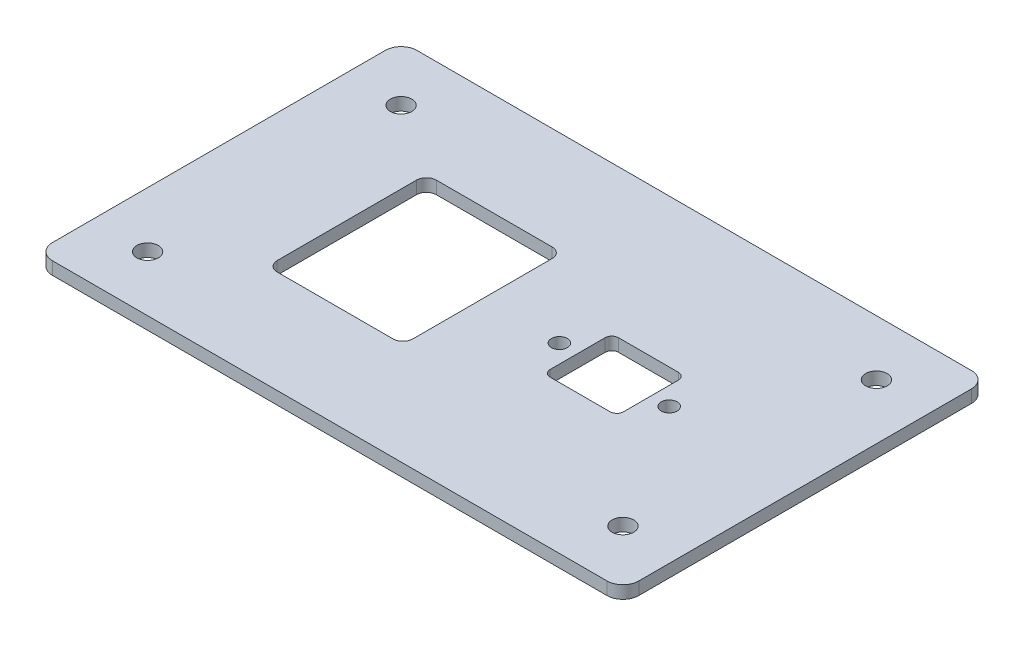
ISO-10303-21;
HEADER;
FILE_DESCRIPTION(('STEP AP214'),'2;1');
FILE_NAME('part.step','',(''),(''),'','','');
FILE_SCHEMA(('AUTOMOTIVE_DESIGN { 1 0 10303 214 1 1 1 1 }'));
ENDSEC;
DATA;
#1=APPLICATION_CONTEXT('core data for automotive mechanical design processes');
#2=APPLICATION_PROTOCOL_DEFINITION('international standard','automotive_design',2000,#1);
#3=PRODUCT_CONTEXT('',#1,'mechanical');
#4=PRODUCT('Part','Part','',(#3));
#5=PRODUCT_RELATED_PRODUCT_CATEGORY('part','',(#4));
#6=PRODUCT_DEFINITION_FORMATION('','',#4);
#7=PRODUCT_DEFINITION_CONTEXT('part definition',#1,'design');
#8=PRODUCT_DEFINITION('design','',#6,#7);
#9=PRODUCT_DEFINITION_SHAPE('','',#8);
#10=(LENGTH_UNIT() NAMED_UNIT(*) SI_UNIT(.MILLI.,.METRE.));
#11=(NAMED_UNIT(*) PLANE_ANGLE_UNIT() SI_UNIT($,.RADIAN.));
#12=(NAMED_UNIT(*) SI_UNIT($,.STERADIAN.) SOLID_ANGLE_UNIT());
#13=UNCERTAINTY_MEASURE_WITH_UNIT(LENGTH_MEASURE(1.E-05),#10,'distance_accuracy_value','');
#14=(GEOMETRIC_REPRESENTATION_CONTEXT(3) GLOBAL_UNCERTAINTY_ASSIGNED_CONTEXT((#13)) GLOBAL_UNIT_ASSIGNED_CONTEXT((#10,
#11,#12)) REPRESENTATION_CONTEXT('',''));
#15=CARTESIAN_POINT('',(0.,0.,0.));
#16=DIRECTION('',(0.,0.,1.));
#17=DIRECTION('',(1.,0.,0.));
#18=AXIS2_PLACEMENT_3D('',#15,#16,#17);
#19=CARTESIAN_POINT('',(55.5625,2.54,-33.3375));
#20=DIRECTION('',(0.,-1.,0.));
#21=DIRECTION('',(0.,0.,-1.));
#22=AXIS2_PLACEMENT_3D('',#19,#20,#21);
#23=PLANE('',#22);
#24=CARTESIAN_POINT('',(31.5,2.54,0.));
#25=DIRECTION('',(0.,1.,0.));
#26=DIRECTION('',(0.,0.,1.));
#27=AXIS2_PLACEMENT_3D('',#24,#25,#26);
#28=CIRCLE('',#27,1.6);
#29=CARTESIAN_POINT('',(31.5,2.54,1.6));
#30=VERTEX_POINT('',#29);
#31=EDGE_CURVE('E447',#30,#30,#28,.T.);
#32=ORIENTED_EDGE('',*,*,#31,.F.);
#33=EDGE_LOOP('',(#32));
#34=FACE_BOUND('',#33,.T.);
#35=CARTESIAN_POINT('',(9.49999999999999,2.54,0.));
#36=DIRECTION('',(0.,1.,0.));
#37=DIRECTION('',(0.,0.,1.));
#38=AXIS2_PLACEMENT_3D('',#35,#36,#37);
#39=CIRCLE('',#38,1.6);
#40=CARTESIAN_POINT('',(9.49999999999999,2.54,1.6));
#41=VERTEX_POINT('',#40);
#42=EDGE_CURVE('E459',#41,#41,#39,.T.);
#43=ORIENTED_EDGE('',*,*,#42,.F.);
#44=EDGE_LOOP('',(#43));
#45=FACE_BOUND('',#44,.T.);
#46=CARTESIAN_POINT('',(26.5,2.54,-5.49999999999999));
#47=DIRECTION('',(0.,1.,0.));
#48=DIRECTION('',(0.,0.,-1.));
#49=AXIS2_PLACEMENT_3D('',#46,#47,#48);
#50=CIRCLE('',#49,1.35);
#51=CARTESIAN_POINT('',(27.85,2.54,-5.49999999999999));
#52=VERTEX_POINT('',#51);
#53=CARTESIAN_POINT('',(26.5,2.54,-6.85));
#54=VERTEX_POINT('',#53);
#55=EDGE_CURVE('E466',#52,#54,#50,.T.);
#56=ORIENTED_EDGE('',*,*,#55,.F.);
#57=DIRECTION('',(0.,0.,-1.));
#58=VECTOR('',#57,1.);
#59=CARTESIAN_POINT('',(27.85,2.54,5.50000000000001));
#60=LINE('',#59,#58);
#61=CARTESIAN_POINT('',(27.85,2.54,5.50000000000001));
#62=VERTEX_POINT('',#61);
#63=EDGE_CURVE('E517',#62,#52,#60,.T.);
#64=ORIENTED_EDGE('',*,*,#63,.F.);
#65=CARTESIAN_POINT('',(26.5,2.54,5.50000000000001));
#66=DIRECTION('',(0.,1.,0.));
#67=DIRECTION('',(0.,0.,1.));
#68=AXIS2_PLACEMENT_3D('',#65,#66,#67);
#69=CIRCLE('',#68,1.35);
#70=CARTESIAN_POINT('',(26.5,2.54,6.85));
#71=VERTEX_POINT('',#70);
#72=EDGE_CURVE('E542',#71,#62,#69,.T.);
#73=ORIENTED_EDGE('',*,*,#72,.F.);
#74=DIRECTION('',(1.,0.,0.));
#75=VECTOR('',#74,1.);
#76=CARTESIAN_POINT('',(14.5,2.54,6.85));
#77=LINE('',#76,#75);
#78=CARTESIAN_POINT('',(14.5,2.54,6.85));
#79=VERTEX_POINT('',#78);
#80=EDGE_CURVE('E549',#79,#71,#77,.T.);
#81=ORIENTED_EDGE('',*,*,#80,.F.);
#82=CARTESIAN_POINT('',(14.5,2.54,5.5));
#83=DIRECTION('',(0.,1.,0.));
#84=DIRECTION('',(0.,0.,-1.));
#85=AXIS2_PLACEMENT_3D('',#82,#83,#84);
#86=CIRCLE('',#85,1.35);
#87=CARTESIAN_POINT('',(13.15,2.54,5.5));
#88=VERTEX_POINT('',#87);
#89=EDGE_CURVE('E552',#88,#79,#86,.T.);
#90=ORIENTED_EDGE('',*,*,#89,.F.);
#91=DIRECTION('',(0.,0.,1.));
#92=VECTOR('',#91,1.);
#93=CARTESIAN_POINT('',(13.15,2.54,5.5));
#94=LINE('',#93,#92);
#95=CARTESIAN_POINT('',(13.15,2.54,-5.49999999999999));
#96=VERTEX_POINT('',#95);
#97=EDGE_CURVE('E555',#96,#88,#94,.T.);
#98=ORIENTED_EDGE('',*,*,#97,.F.);
#99=CARTESIAN_POINT('',(14.5,2.54,-5.49999999999999));
#100=DIRECTION('',(0.,1.,0.));
#101=DIRECTION('',(0.,0.,-1.));
#102=AXIS2_PLACEMENT_3D('',#99,#100,#101);
#103=CIRCLE('',#102,1.35);
#104=CARTESIAN_POINT('',(14.5,2.54,-6.85));
#105=VERTEX_POINT('',#104);
#106=EDGE_CURVE('E475',#105,#96,#103,.T.);
#107=ORIENTED_EDGE('',*,*,#106,.F.);
#108=DIRECTION('',(-1.,0.,0.));
#109=VECTOR('',#108,1.);
#110=CARTESIAN_POINT('',(14.5,2.54,-6.85));
#111=LINE('',#110,#109);
#112=EDGE_CURVE('E470',#54,#105,#111,.T.);
#113=ORIENTED_EDGE('',*,*,#112,.F.);
#114=EDGE_LOOP('',(#56,#64,#73,#81,#90,#98,#107,#113));
#115=FACE_BOUND('',#114,.T.);
#116=CARTESIAN_POINT('',(55.5625,2.54,-33.3375));
#117=DIRECTION('',(0.,1.,0.));
#118=DIRECTION('',(0.,0.,-1.));
#119=AXIS2_PLACEMENT_3D('',#116,#117,#118);
#120=CIRCLE('',#119,3.175);
#121=CARTESIAN_POINT('',(58.7375,2.54,-33.3375));
#122=VERTEX_POINT('',#121);
#123=CARTESIAN_POINT('',(55.5625,2.54,-36.5125));
#124=VERTEX_POINT('',#123);
#125=EDGE_CURVE('E352',#122,#124,#120,.T.);
#126=ORIENTED_EDGE('',*,*,#125,.T.);
#127=DIRECTION('',(-1.,0.,0.));
#128=VECTOR('',#127,1.);
#129=CARTESIAN_POINT('',(-55.5625,2.54,-36.5125));
#130=LINE('',#129,#128);
#131=CARTESIAN_POINT('',(-55.5625,2.54,-36.5125));
#132=VERTEX_POINT('',#131);
#133=EDGE_CURVE('E381',#124,#132,#130,.T.);
#134=ORIENTED_EDGE('',*,*,#133,.T.);
#135=CARTESIAN_POINT('',(-55.5625,2.54,-33.3375));
#136=DIRECTION('',(0.,1.,0.));
#137=DIRECTION('',(0.,0.,1.));
#138=AXIS2_PLACEMENT_3D('',#135,#136,#137);
#139=CIRCLE('',#138,3.175);
#140=CARTESIAN_POINT('',(-58.7375,2.54,-33.3375));
#141=VERTEX_POINT('',#140);
#142=EDGE_CURVE('E334',#132,#141,#139,.T.);
#143=ORIENTED_EDGE('',*,*,#142,.T.);
#144=DIRECTION('',(0.,0.,1.));
#145=VECTOR('',#144,1.);
#146=CARTESIAN_POINT('',(-58.7375,2.54,33.3375));
#147=LINE('',#146,#145);
#148=CARTESIAN_POINT('',(-58.7375,2.54,33.3375));
#149=VERTEX_POINT('',#148);
#150=EDGE_CURVE('E371',#141,#149,#147,.T.);
#151=ORIENTED_EDGE('',*,*,#150,.T.);
#152=CARTESIAN_POINT('',(-55.5625,2.54,33.3375));
#153=DIRECTION('',(0.,1.,0.));
#154=DIRECTION('',(0.,0.,-1.));
#155=AXIS2_PLACEMENT_3D('',#152,#153,#154);
#156=CIRCLE('',#155,3.175);
#157=CARTESIAN_POINT('',(-55.5625,2.54,36.5125));
#158=VERTEX_POINT('',#157);
#159=EDGE_CURVE('E375',#149,#158,#156,.T.);
#160=ORIENTED_EDGE('',*,*,#159,.T.);
#161=DIRECTION('',(1.,0.,0.));
#162=VECTOR('',#161,1.);
#163=CARTESIAN_POINT('',(-55.5625,2.54,36.5125));
#164=LINE('',#163,#162);
#165=CARTESIAN_POINT('',(55.5625,2.54,36.5125));
#166=VERTEX_POINT('',#165);
#167=EDGE_CURVE('E379',#158,#166,#164,.T.);
#168=ORIENTED_EDGE('',*,*,#167,.T.);
#169=CARTESIAN_POINT('',(55.5625,2.54,33.3375));
#170=DIRECTION('',(0.,1.,0.));
#171=DIRECTION('',(0.,0.,-1.));
#172=AXIS2_PLACEMENT_3D('',#169,#170,#171);
#173=CIRCLE('',#172,3.175);
#174=CARTESIAN_POINT('',(58.7375,2.54,33.3375));
#175=VERTEX_POINT('',#174);
#176=EDGE_CURVE('E398',#166,#175,#173,.T.);
#177=ORIENTED_EDGE('',*,*,#176,.T.);
#178=DIRECTION('',(0.,0.,-1.));
#179=VECTOR('',#178,1.);
#180=CARTESIAN_POINT('',(58.7375,2.54,33.3375));
#181=LINE('',#180,#179);
#182=EDGE_CURVE('E357',#175,#122,#181,.T.);
#183=ORIENTED_EDGE('',*,*,#182,.T.);
#184=EDGE_LOOP('',(#126,#134,#143,#151,#160,#168,#177,#183));
#185=FACE_BOUND('',#184,.T.);
#186=CARTESIAN_POINT('',(-31.1,2.54,13.95));
#187=DIRECTION('',(0.,1.,0.));
#188=DIRECTION('',(0.,0.,1.));
#189=AXIS2_PLACEMENT_3D('',#186,#187,#188);
#190=CIRCLE('',#189,2.);
#191=CARTESIAN_POINT('',(-33.1,2.54,13.95));
#192=VERTEX_POINT('',#191);
#193=CARTESIAN_POINT('',(-31.1,2.54,15.95));
#194=VERTEX_POINT('',#193);
#195=EDGE_CURVE('E197',#192,#194,#190,.T.);
#196=ORIENTED_EDGE('',*,*,#195,.F.);
#197=DIRECTION('',(0.,0.,1.));
#198=VECTOR('',#197,1.);
#199=CARTESIAN_POINT('',(-33.1,2.54,-13.95));
#200=LINE('',#199,#198);
#201=CARTESIAN_POINT('',(-33.1,2.54,-13.95));
#202=VERTEX_POINT('',#201);
#203=EDGE_CURVE('E410',#202,#192,#200,.T.);
#204=ORIENTED_EDGE('',*,*,#203,.F.);
#205=CARTESIAN_POINT('',(-31.1,2.54,-13.95));
#206=DIRECTION('',(0.,1.,0.));
#207=DIRECTION('',(0.,0.,1.));
#208=AXIS2_PLACEMENT_3D('',#205,#206,#207);
#209=CIRCLE('',#208,2.);
#210=CARTESIAN_POINT('',(-31.1,2.54,-15.95));
#211=VERTEX_POINT('',#210);
#212=EDGE_CURVE('E414',#211,#202,#209,.T.);
#213=ORIENTED_EDGE('',*,*,#212,.F.);
#214=DIRECTION('',(-1.,0.,0.));
#215=VECTOR('',#214,1.);
#216=CARTESIAN_POINT('',(-7.9,2.54,-15.95));
#217=LINE('',#216,#215);
#218=CARTESIAN_POINT('',(-7.9,2.54,-15.95));
#219=VERTEX_POINT('',#218);
#220=EDGE_CURVE('E862',#219,#211,#217,.T.);
#221=ORIENTED_EDGE('',*,*,#220,.F.);
#222=CARTESIAN_POINT('',(-7.9,2.54,-13.95));
#223=DIRECTION('',(0.,1.,0.));
#224=DIRECTION('',(0.,0.,1.));
#225=AXIS2_PLACEMENT_3D('',#222,#223,#224);
#226=CIRCLE('',#225,2.);
#227=CARTESIAN_POINT('',(-5.9,2.54,-13.95));
#228=VERTEX_POINT('',#227);
#229=EDGE_CURVE('E864',#228,#219,#226,.T.);
#230=ORIENTED_EDGE('',*,*,#229,.F.);
#231=DIRECTION('',(0.,0.,-1.));
#232=VECTOR('',#231,1.);
#233=CARTESIAN_POINT('',(-5.9,2.54,-13.95));
#234=LINE('',#233,#232);
#235=CARTESIAN_POINT('',(-5.9,2.54,13.95));
#236=VERTEX_POINT('',#235);
#237=EDGE_CURVE('E225',#236,#228,#234,.T.);
#238=ORIENTED_EDGE('',*,*,#237,.F.);
#239=CARTESIAN_POINT('',(-7.9,2.54,13.95));
#240=DIRECTION('',(0.,1.,0.));
#241=DIRECTION('',(0.,0.,1.));
#242=AXIS2_PLACEMENT_3D('',#239,#240,#241);
#243=CIRCLE('',#242,2.);
#244=CARTESIAN_POINT('',(-7.9,2.54,15.95));
#245=VERTEX_POINT('',#244);
#246=EDGE_CURVE('E220',#245,#236,#243,.T.);
#247=ORIENTED_EDGE('',*,*,#246,.F.);
#248=DIRECTION('',(1.,0.,0.));
#249=VECTOR('',#248,1.);
#250=CARTESIAN_POINT('',(-7.9,2.54,15.95));
#251=LINE('',#250,#249);
#252=EDGE_CURVE('E206',#194,#245,#251,.T.);
#253=ORIENTED_EDGE('',*,*,#252,.F.);
#254=EDGE_LOOP('',(#196,#204,#213,#221,#230,#238,#247,#253));
#255=FACE_BOUND('',#254,.T.);
#256=CARTESIAN_POINT('',(47.625,2.54,-25.4));
#257=DIRECTION('',(0.,1.,0.));
#258=DIRECTION('',(0.,0.,-1.));
#259=AXIS2_PLACEMENT_3D('',#256,#257,#258);
#260=CIRCLE('',#259,2.15265000000001);
#261=CARTESIAN_POINT('',(47.625,2.54,-27.55265));
#262=VERTEX_POINT('',#261);
#263=EDGE_CURVE('E239',#262,#262,#260,.T.);
#264=ORIENTED_EDGE('',*,*,#263,.F.);
#265=EDGE_LOOP('',(#264));
#266=FACE_BOUND('',#265,.T.);
#267=CARTESIAN_POINT('',(47.625,2.54,25.4));
#268=DIRECTION('',(0.,1.,0.));
#269=DIRECTION('',(0.,0.,1.));
#270=AXIS2_PLACEMENT_3D('',#267,#268,#269);
#271=CIRCLE('',#270,2.15265000000001);
#272=CARTESIAN_POINT('',(47.625,2.54,27.55265));
#273=VERTEX_POINT('',#272);
#274=EDGE_CURVE('E246',#273,#273,#271,.T.);
#275=ORIENTED_EDGE('',*,*,#274,.F.);
#276=EDGE_LOOP('',(#275));
#277=FACE_BOUND('',#276,.T.);
#278=CARTESIAN_POINT('',(-47.625,2.54,-25.4));
#279=DIRECTION('',(0.,1.,0.));
#280=DIRECTION('',(0.,0.,1.));
#281=AXIS2_PLACEMENT_3D('',#278,#279,#280);
#282=CIRCLE('',#281,2.15265000000001);
#283=CARTESIAN_POINT('',(-47.625,2.54,-23.24735));
#284=VERTEX_POINT('',#283);
#285=EDGE_CURVE('E255',#284,#284,#282,.T.);
#286=ORIENTED_EDGE('',*,*,#285,.F.);
#287=EDGE_LOOP('',(#286));
#288=FACE_BOUND('',#287,.T.);
#289=CARTESIAN_POINT('',(-47.625,2.54,25.4));
#290=DIRECTION('',(0.,1.,0.));
#291=DIRECTION('',(0.,0.,-1.));
#292=AXIS2_PLACEMENT_3D('',#289,#290,#291);
#293=CIRCLE('',#292,2.15265000000001);
#294=CARTESIAN_POINT('',(-47.625,2.54,23.24735));
#295=VERTEX_POINT('',#294);
#296=EDGE_CURVE('E261',#295,#295,#293,.T.);
#297=ORIENTED_EDGE('',*,*,#296,.F.);
#298=EDGE_LOOP('',(#297));
#299=FACE_BOUND('',#298,.T.);
#300=ADVANCED_FACE('F36',(#34,#45,#115,#185,#255,#266,#277,#288,#299),#23,.F.);
#301=CARTESIAN_POINT('',(55.5625,0.,-33.3375));
#302=DIRECTION('',(0.,-1.,0.));
#303=DIRECTION('',(0.,0.,-1.));
#304=AXIS2_PLACEMENT_3D('',#301,#302,#303);
#305=PLANE('',#304);
#306=CARTESIAN_POINT('',(-47.625,0.,-25.4));
#307=DIRECTION('',(0.,1.,0.));
#308=DIRECTION('',(0.,0.,1.));
#309=AXIS2_PLACEMENT_3D('',#306,#307,#308);
#310=CIRCLE('',#309,2.15265000000001);
#311=CARTESIAN_POINT('',(-47.625,0.,-23.24735));
#312=VERTEX_POINT('',#311);
#313=EDGE_CURVE('E258',#312,#312,#310,.T.);
#314=ORIENTED_EDGE('',*,*,#313,.T.);
#315=EDGE_LOOP('',(#314));
#316=FACE_BOUND('',#315,.T.);
#317=CARTESIAN_POINT('',(47.625,0.,-25.4));
#318=DIRECTION('',(0.,1.,0.));
#319=DIRECTION('',(0.,0.,-1.));
#320=AXIS2_PLACEMENT_3D('',#317,#318,#319);
#321=CIRCLE('',#320,2.15265000000001);
#322=CARTESIAN_POINT('',(47.625,0.,-27.55265));
#323=VERTEX_POINT('',#322);
#324=EDGE_CURVE('E243',#323,#323,#321,.T.);
#325=ORIENTED_EDGE('',*,*,#324,.T.);
#326=EDGE_LOOP('',(#325));
#327=FACE_BOUND('',#326,.T.);
#328=CARTESIAN_POINT('',(9.49999999999999,0.,0.));
#329=DIRECTION('',(0.,1.,0.));
#330=DIRECTION('',(0.,0.,1.));
#331=AXIS2_PLACEMENT_3D('',#328,#329,#330);
#332=CIRCLE('',#331,1.6);
#333=CARTESIAN_POINT('',(9.49999999999999,0.,1.6));
#334=VERTEX_POINT('',#333);
#335=EDGE_CURVE('E452',#334,#334,#332,.T.);
#336=ORIENTED_EDGE('',*,*,#335,.T.);
#337=EDGE_LOOP('',(#336));
#338=FACE_BOUND('',#337,.T.);
#339=CARTESIAN_POINT('',(55.5625,0.,-33.3375));
#340=DIRECTION('',(0.,1.,0.));
#341=DIRECTION('',(0.,0.,-1.));
#342=AXIS2_PLACEMENT_3D('',#339,#340,#341);
#343=CIRCLE('',#342,3.175);
#344=CARTESIAN_POINT('',(58.7375,0.,-33.3375));
#345=VERTEX_POINT('',#344);
#346=CARTESIAN_POINT('',(55.5625,0.,-36.5125));
#347=VERTEX_POINT('',#346);
#348=EDGE_CURVE('E330',#345,#347,#343,.T.);
#349=ORIENTED_EDGE('',*,*,#348,.F.);
#350=DIRECTION('',(0.,0.,-1.));
#351=VECTOR('',#350,1.);
#352=CARTESIAN_POINT('',(58.7375,0.,33.3375));
#353=LINE('',#352,#351);
#354=CARTESIAN_POINT('',(58.7375,0.,33.3375));
#355=VERTEX_POINT('',#354);
#356=EDGE_CURVE('E350',#355,#345,#353,.T.);
#357=ORIENTED_EDGE('',*,*,#356,.F.);
#358=CARTESIAN_POINT('',(55.5625,0.,33.3375));
#359=DIRECTION('',(0.,1.,0.));
#360=DIRECTION('',(0.,0.,-1.));
#361=AXIS2_PLACEMENT_3D('',#358,#359,#360);
#362=CIRCLE('',#361,3.175);
#363=CARTESIAN_POINT('',(55.5625,0.,36.5125));
#364=VERTEX_POINT('',#363);
#365=EDGE_CURVE('E348',#364,#355,#362,.T.);
#366=ORIENTED_EDGE('',*,*,#365,.F.);
#367=DIRECTION('',(1.,0.,0.));
#368=VECTOR('',#367,1.);
#369=CARTESIAN_POINT('',(-55.5625,0.,36.5125));
#370=LINE('',#369,#368);
#371=CARTESIAN_POINT('',(-55.5625,0.,36.5125));
#372=VERTEX_POINT('',#371);
#373=EDGE_CURVE('E346',#372,#364,#370,.T.);
#374=ORIENTED_EDGE('',*,*,#373,.F.);
#375=CARTESIAN_POINT('',(-55.5625,0.,33.3375));
#376=DIRECTION('',(0.,1.,0.));
#377=DIRECTION('',(0.,0.,-1.));
#378=AXIS2_PLACEMENT_3D('',#375,#376,#377);
#379=CIRCLE('',#378,3.175);
#380=CARTESIAN_POINT('',(-58.7375,0.,33.3375));
#381=VERTEX_POINT('',#380);
#382=EDGE_CURVE('E341',#381,#372,#379,.T.);
#383=ORIENTED_EDGE('',*,*,#382,.F.);
#384=DIRECTION('',(0.,0.,1.));
#385=VECTOR('',#384,1.);
#386=CARTESIAN_POINT('',(-58.7375,0.,33.3375));
#387=LINE('',#386,#385);
#388=CARTESIAN_POINT('',(-58.7375,0.,-33.3375));
#389=VERTEX_POINT('',#388);
#390=EDGE_CURVE('E339',#389,#381,#387,.T.);
#391=ORIENTED_EDGE('',*,*,#390,.F.);
#392=CARTESIAN_POINT('',(-55.5625,0.,-33.3375));
#393=DIRECTION('',(0.,1.,0.));
#394=DIRECTION('',(0.,0.,1.));
#395=AXIS2_PLACEMENT_3D('',#392,#393,#394);
#396=CIRCLE('',#395,3.175);
#397=CARTESIAN_POINT('',(-55.5625,0.,-36.5125));
#398=VERTEX_POINT('',#397);
#399=EDGE_CURVE('E329',#398,#389,#396,.T.);
#400=ORIENTED_EDGE('',*,*,#399,.F.);
#401=DIRECTION('',(-1.,0.,0.));
#402=VECTOR('',#401,1.);
#403=CARTESIAN_POINT('',(-55.5625,0.,-36.5125));
#404=LINE('',#403,#402);
#405=EDGE_CURVE('E321',#347,#398,#404,.T.);
#406=ORIENTED_EDGE('',*,*,#405,.F.);
#407=EDGE_LOOP('',(#349,#357,#366,#374,#383,#391,#400,#406));
#408=FACE_BOUND('',#407,.T.);
#409=DIRECTION('',(0.,0.,-1.));
#410=VECTOR('',#409,1.);
#411=CARTESIAN_POINT('',(27.85,0.,5.50000000000001));
#412=LINE('',#411,#410);
#413=CARTESIAN_POINT('',(27.85,0.,5.50000000000001));
#414=VERTEX_POINT('',#413);
#415=CARTESIAN_POINT('',(27.85,0.,-5.49999999999999));
#416=VERTEX_POINT('',#415);
#417=EDGE_CURVE('E471',#414,#416,#412,.T.);
#418=ORIENTED_EDGE('',*,*,#417,.T.);
#419=CARTESIAN_POINT('',(26.5,0.,-5.49999999999999));
#420=DIRECTION('',(0.,1.,0.));
#421=DIRECTION('',(0.,0.,-1.));
#422=AXIS2_PLACEMENT_3D('',#419,#420,#421);
#423=CIRCLE('',#422,1.35);
#424=CARTESIAN_POINT('',(26.5,0.,-6.85));
#425=VERTEX_POINT('',#424);
#426=EDGE_CURVE('E464',#416,#425,#423,.T.);
#427=ORIENTED_EDGE('',*,*,#426,.T.);
#428=DIRECTION('',(-1.,0.,0.));
#429=VECTOR('',#428,1.);
#430=CARTESIAN_POINT('',(14.5,0.,-6.85));
#431=LINE('',#430,#429);
#432=CARTESIAN_POINT('',(14.5,0.,-6.85));
#433=VERTEX_POINT('',#432);
#434=EDGE_CURVE('E535',#425,#433,#431,.T.);
#435=ORIENTED_EDGE('',*,*,#434,.T.);
#436=CARTESIAN_POINT('',(14.5,0.,-5.49999999999999));
#437=DIRECTION('',(0.,1.,0.));
#438=DIRECTION('',(0.,0.,-1.));
#439=AXIS2_PLACEMENT_3D('',#436,#437,#438);
#440=CIRCLE('',#439,1.35);
#441=CARTESIAN_POINT('',(13.15,0.,-5.49999999999999));
#442=VERTEX_POINT('',#441);
#443=EDGE_CURVE('E532',#433,#442,#440,.T.);
#444=ORIENTED_EDGE('',*,*,#443,.T.);
#445=DIRECTION('',(0.,0.,1.));
#446=VECTOR('',#445,1.);
#447=CARTESIAN_POINT('',(13.15,0.,5.5));
#448=LINE('',#447,#446);
#449=CARTESIAN_POINT('',(13.15,0.,5.5));
#450=VERTEX_POINT('',#449);
#451=EDGE_CURVE('E529',#442,#450,#448,.T.);
#452=ORIENTED_EDGE('',*,*,#451,.T.);
#453=CARTESIAN_POINT('',(14.5,0.,5.5));
#454=DIRECTION('',(0.,1.,0.));
#455=DIRECTION('',(0.,0.,-1.));
#456=AXIS2_PLACEMENT_3D('',#453,#454,#455);
#457=CIRCLE('',#456,1.35);
#458=CARTESIAN_POINT('',(14.5,0.,6.85));
#459=VERTEX_POINT('',#458);
#460=EDGE_CURVE('E526',#450,#459,#457,.T.);
#461=ORIENTED_EDGE('',*,*,#460,.T.);
#462=DIRECTION('',(1.,0.,0.));
#463=VECTOR('',#462,1.);
#464=CARTESIAN_POINT('',(14.5,0.,6.85));
#465=LINE('',#464,#463);
#466=CARTESIAN_POINT('',(26.5,0.,6.85));
#467=VERTEX_POINT('',#466);
#468=EDGE_CURVE('E523',#459,#467,#465,.T.);
#469=ORIENTED_EDGE('',*,*,#468,.T.);
#470=CARTESIAN_POINT('',(26.5,0.,5.50000000000001));
#471=DIRECTION('',(0.,1.,0.));
#472=DIRECTION('',(0.,0.,1.));
#473=AXIS2_PLACEMENT_3D('',#470,#471,#472);
#474=CIRCLE('',#473,1.35);
#475=EDGE_CURVE('E520',#467,#414,#474,.T.);
#476=ORIENTED_EDGE('',*,*,#475,.T.);
#477=EDGE_LOOP('',(#418,#427,#435,#444,#452,#461,#469,#476));
#478=FACE_BOUND('',#477,.T.);
#479=CARTESIAN_POINT('',(31.5,0.,0.));
#480=DIRECTION('',(0.,1.,0.));
#481=DIRECTION('',(0.,0.,1.));
#482=AXIS2_PLACEMENT_3D('',#479,#480,#481);
#483=CIRCLE('',#482,1.6);
#484=CARTESIAN_POINT('',(31.5,0.,1.6));
#485=VERTEX_POINT('',#484);
#486=EDGE_CURVE('E214',#485,#485,#483,.T.);
#487=ORIENTED_EDGE('',*,*,#486,.T.);
#488=EDGE_LOOP('',(#487));
#489=FACE_BOUND('',#488,.T.);
#490=DIRECTION('',(0.,0.,1.));
#491=VECTOR('',#490,1.);
#492=CARTESIAN_POINT('',(-33.1,0.,-13.95));
#493=LINE('',#492,#491);
#494=CARTESIAN_POINT('',(-33.1,0.,-13.95));
#495=VERTEX_POINT('',#494);
#496=CARTESIAN_POINT('',(-33.1,0.,13.95));
#497=VERTEX_POINT('',#496);
#498=EDGE_CURVE('E207',#495,#497,#493,.T.);
#499=ORIENTED_EDGE('',*,*,#498,.T.);
#500=CARTESIAN_POINT('',(-31.1,0.,13.95));
#501=DIRECTION('',(0.,1.,0.));
#502=DIRECTION('',(0.,0.,1.));
#503=AXIS2_PLACEMENT_3D('',#500,#501,#502);
#504=CIRCLE('',#503,2.);
#505=CARTESIAN_POINT('',(-31.1,0.,15.95));
#506=VERTEX_POINT('',#505);
#507=EDGE_CURVE('E59',#497,#506,#504,.T.);
#508=ORIENTED_EDGE('',*,*,#507,.T.);
#509=DIRECTION('',(1.,0.,0.));
#510=VECTOR('',#509,1.);
#511=CARTESIAN_POINT('',(-7.9,0.,15.95));
#512=LINE('',#511,#510);
#513=CARTESIAN_POINT('',(-7.9,0.,15.95));
#514=VERTEX_POINT('',#513);
#515=EDGE_CURVE('E213',#506,#514,#512,.T.);
#516=ORIENTED_EDGE('',*,*,#515,.T.);
#517=CARTESIAN_POINT('',(-7.9,0.,13.95));
#518=DIRECTION('',(0.,1.,0.));
#519=DIRECTION('',(0.,0.,1.));
#520=AXIS2_PLACEMENT_3D('',#517,#518,#519);
#521=CIRCLE('',#520,2.);
#522=CARTESIAN_POINT('',(-5.9,0.,13.95));
#523=VERTEX_POINT('',#522);
#524=EDGE_CURVE('E419',#514,#523,#521,.T.);
#525=ORIENTED_EDGE('',*,*,#524,.T.);
#526=DIRECTION('',(0.,0.,-1.));
#527=VECTOR('',#526,1.);
#528=CARTESIAN_POINT('',(-5.9,0.,-13.95));
#529=LINE('',#528,#527);
#530=CARTESIAN_POINT('',(-5.9,0.,-13.95));
#531=VERTEX_POINT('',#530);
#532=EDGE_CURVE('E422',#523,#531,#529,.T.);
#533=ORIENTED_EDGE('',*,*,#532,.T.);
#534=CARTESIAN_POINT('',(-7.9,0.,-13.95));
#535=DIRECTION('',(0.,1.,0.));
#536=DIRECTION('',(0.,0.,1.));
#537=AXIS2_PLACEMENT_3D('',#534,#535,#536);
#538=CIRCLE('',#537,2.);
#539=CARTESIAN_POINT('',(-7.9,0.,-15.95));
#540=VERTEX_POINT('',#539);
#541=EDGE_CURVE('E425',#531,#540,#538,.T.);
#542=ORIENTED_EDGE('',*,*,#541,.T.);
#543=DIRECTION('',(-1.,0.,0.));
#544=VECTOR('',#543,1.);
#545=CARTESIAN_POINT('',(-7.9,0.,-15.95));
#546=LINE('',#545,#544);
#547=CARTESIAN_POINT('',(-31.1,0.,-15.95));
#548=VERTEX_POINT('',#547);
#549=EDGE_CURVE('E428',#540,#548,#546,.T.);
#550=ORIENTED_EDGE('',*,*,#549,.T.);
#551=CARTESIAN_POINT('',(-31.1,0.,-13.95));
#552=DIRECTION('',(0.,1.,0.));
#553=DIRECTION('',(0.,0.,1.));
#554=AXIS2_PLACEMENT_3D('',#551,#552,#553);
#555=CIRCLE('',#554,2.);
#556=EDGE_CURVE('E431',#548,#495,#555,.T.);
#557=ORIENTED_EDGE('',*,*,#556,.T.);
#558=EDGE_LOOP('',(#499,#508,#516,#525,#533,#542,#550,#557));
#559=FACE_BOUND('',#558,.T.);
#560=CARTESIAN_POINT('',(47.625,0.,25.4));
#561=DIRECTION('',(0.,1.,0.));
#562=DIRECTION('',(0.,0.,1.));
#563=AXIS2_PLACEMENT_3D('',#560,#561,#562);
#564=CIRCLE('',#563,2.15265000000001);
#565=CARTESIAN_POINT('',(47.625,0.,27.55265));
#566=VERTEX_POINT('',#565);
#567=EDGE_CURVE('E244',#566,#566,#564,.T.);
#568=ORIENTED_EDGE('',*,*,#567,.T.);
#569=EDGE_LOOP('',(#568));
#570=FACE_BOUND('',#569,.T.);
#571=CARTESIAN_POINT('',(-47.625,0.,25.4));
#572=DIRECTION('',(0.,1.,0.));
#573=DIRECTION('',(0.,0.,-1.));
#574=AXIS2_PLACEMENT_3D('',#571,#572,#573);
#575=CIRCLE('',#574,2.15265000000001);
#576=CARTESIAN_POINT('',(-47.625,0.,23.24735));
#577=VERTEX_POINT('',#576);
#578=EDGE_CURVE('E265',#577,#577,#575,.T.);
#579=ORIENTED_EDGE('',*,*,#578,.T.);
#580=EDGE_LOOP('',(#579));
#581=FACE_BOUND('',#580,.T.);
#582=ADVANCED_FACE('F276',(#316,#327,#338,#408,#478,#489,#559,#570,#581),#305,.T.);
#583=CARTESIAN_POINT('',(55.5625,2.54,-33.3375));
#584=DIRECTION('',(0.,-1.,0.));
#585=DIRECTION('',(0.,0.,-1.));
#586=AXIS2_PLACEMENT_3D('',#583,#584,#585);
#587=CYLINDRICAL_SURFACE('',#586,3.175);
#588=ORIENTED_EDGE('',*,*,#348,.T.);
#589=DIRECTION('',(0.,-1.,0.));
#590=VECTOR('',#589,1.);
#591=CARTESIAN_POINT('',(55.5625,2.54,-36.5125));
#592=LINE('',#591,#590);
#593=EDGE_CURVE('E12',#124,#347,#592,.T.);
#594=ORIENTED_EDGE('',*,*,#593,.F.);
#595=ORIENTED_EDGE('',*,*,#125,.F.);
#596=DIRECTION('',(0.,-1.,0.));
#597=VECTOR('',#596,1.);
#598=CARTESIAN_POINT('',(58.7375,2.54,-33.3375));
#599=LINE('',#598,#597);
#600=EDGE_CURVE('E353',#122,#345,#599,.T.);
#601=ORIENTED_EDGE('',*,*,#600,.T.);
#602=EDGE_LOOP('',(#588,#594,#595,#601));
#603=FACE_BOUND('',#602,.T.);
#604=ADVANCED_FACE('F38',(#603),#587,.T.);
#605=CARTESIAN_POINT('',(-55.5625,2.54,-36.5125));
#606=DIRECTION('',(0.,0.,1.));
#607=DIRECTION('',(1.,0.,0.));
#608=AXIS2_PLACEMENT_3D('',#605,#606,#607);
#609=PLANE('',#608);
#610=ORIENTED_EDGE('',*,*,#405,.T.);
#611=DIRECTION('',(0.,-1.,0.));
#612=VECTOR('',#611,1.);
#613=CARTESIAN_POINT('',(-55.5625,2.54,-36.5125));
#614=LINE('',#613,#612);
#615=EDGE_CURVE('E44',#132,#398,#614,.T.);
#616=ORIENTED_EDGE('',*,*,#615,.F.);
#617=ORIENTED_EDGE('',*,*,#133,.F.);
#618=ORIENTED_EDGE('',*,*,#593,.T.);
#619=EDGE_LOOP('',(#610,#616,#617,#618));
#620=FACE_BOUND('',#619,.T.);
#621=ADVANCED_FACE('F312',(#620),#609,.F.);
#622=CARTESIAN_POINT('',(-55.5625,2.54,-33.3375));
#623=DIRECTION('',(0.,-1.,0.));
#624=DIRECTION('',(0.,0.,-1.));
#625=AXIS2_PLACEMENT_3D('',#622,#623,#624);
#626=CYLINDRICAL_SURFACE('',#625,3.175);
#627=ORIENTED_EDGE('',*,*,#399,.T.);
#628=DIRECTION('',(0.,-1.,0.));
#629=VECTOR('',#628,1.);
#630=CARTESIAN_POINT('',(-58.7375,2.54,-33.3375));
#631=LINE('',#630,#629);
#632=EDGE_CURVE('E335',#141,#389,#631,.T.);
#633=ORIENTED_EDGE('',*,*,#632,.F.);
#634=ORIENTED_EDGE('',*,*,#142,.F.);
#635=ORIENTED_EDGE('',*,*,#615,.T.);
#636=EDGE_LOOP('',(#627,#633,#634,#635));
#637=FACE_BOUND('',#636,.T.);
#638=ADVANCED_FACE('F309',(#637),#626,.T.);
#639=CARTESIAN_POINT('',(-58.7375,2.54,33.3375));
#640=DIRECTION('',(1.,0.,0.));
#641=DIRECTION('',(0.,0.,-1.));
#642=AXIS2_PLACEMENT_3D('',#639,#640,#641);
#643=PLANE('',#642);
#644=ORIENTED_EDGE('',*,*,#390,.T.);
#645=DIRECTION('',(0.,-1.,0.));
#646=VECTOR('',#645,1.);
#647=CARTESIAN_POINT('',(-58.7375,2.54,33.3375));
#648=LINE('',#647,#646);
#649=EDGE_CURVE('E366',#149,#381,#648,.T.);
#650=ORIENTED_EDGE('',*,*,#649,.F.);
#651=ORIENTED_EDGE('',*,*,#150,.F.);
#652=ORIENTED_EDGE('',*,*,#632,.T.);
#653=EDGE_LOOP('',(#644,#650,#651,#652));
#654=FACE_BOUND('',#653,.T.);
#655=ADVANCED_FACE('F305',(#654),#643,.F.);
#656=CARTESIAN_POINT('',(-55.5625,2.54,33.3375));
#657=DIRECTION('',(0.,-1.,0.));
#658=DIRECTION('',(0.,0.,-1.));
#659=AXIS2_PLACEMENT_3D('',#656,#657,#658);
#660=CYLINDRICAL_SURFACE('',#659,3.175);
#661=ORIENTED_EDGE('',*,*,#382,.T.);
#662=DIRECTION('',(0.,-1.,0.));
#663=VECTOR('',#662,1.);
#664=CARTESIAN_POINT('',(-55.5625,2.54,36.5125));
#665=LINE('',#664,#663);
#666=EDGE_CURVE('E363',#158,#372,#665,.T.);
#667=ORIENTED_EDGE('',*,*,#666,.F.);
#668=ORIENTED_EDGE('',*,*,#159,.F.);
#669=ORIENTED_EDGE('',*,*,#649,.T.);
#670=EDGE_LOOP('',(#661,#667,#668,#669));
#671=FACE_BOUND('',#670,.T.);
#672=ADVANCED_FACE('F301',(#671),#660,.T.);
#673=CARTESIAN_POINT('',(-55.5625,2.54,36.5125));
#674=DIRECTION('',(0.,0.,-1.));
#675=DIRECTION('',(-1.,0.,0.));
#676=AXIS2_PLACEMENT_3D('',#673,#674,#675);
#677=PLANE('',#676);
#678=ORIENTED_EDGE('',*,*,#373,.T.);
#679=DIRECTION('',(0.,-1.,0.));
#680=VECTOR('',#679,1.);
#681=CARTESIAN_POINT('',(55.5625,2.54,36.5125));
#682=LINE('',#681,#680);
#683=EDGE_CURVE('E360',#166,#364,#682,.T.);
#684=ORIENTED_EDGE('',*,*,#683,.F.);
#685=ORIENTED_EDGE('',*,*,#167,.F.);
#686=ORIENTED_EDGE('',*,*,#666,.T.);
#687=EDGE_LOOP('',(#678,#684,#685,#686));
#688=FACE_BOUND('',#687,.T.);
#689=ADVANCED_FACE('F297',(#688),#677,.F.);
#690=CARTESIAN_POINT('',(55.5625,2.54,33.3375));
#691=DIRECTION('',(0.,-1.,0.));
#692=DIRECTION('',(0.,0.,-1.));
#693=AXIS2_PLACEMENT_3D('',#690,#691,#692);
#694=CYLINDRICAL_SURFACE('',#693,3.175);
#695=ORIENTED_EDGE('',*,*,#365,.T.);
#696=DIRECTION('',(0.,-1.,0.));
#697=VECTOR('',#696,1.);
#698=CARTESIAN_POINT('',(58.7375,2.54,33.3375));
#699=LINE('',#698,#697);
#700=EDGE_CURVE('E356',#175,#355,#699,.T.);
#701=ORIENTED_EDGE('',*,*,#700,.F.);
#702=ORIENTED_EDGE('',*,*,#176,.F.);
#703=ORIENTED_EDGE('',*,*,#683,.T.);
#704=EDGE_LOOP('',(#695,#701,#702,#703));
#705=FACE_BOUND('',#704,.T.);
#706=ADVANCED_FACE('F293',(#705),#694,.T.);
#707=CARTESIAN_POINT('',(58.7375,2.54,33.3375));
#708=DIRECTION('',(-1.,0.,0.));
#709=DIRECTION('',(0.,0.,1.));
#710=AXIS2_PLACEMENT_3D('',#707,#708,#709);
#711=PLANE('',#710);
#712=ORIENTED_EDGE('',*,*,#356,.T.);
#713=ORIENTED_EDGE('',*,*,#600,.F.);
#714=ORIENTED_EDGE('',*,*,#182,.F.);
#715=ORIENTED_EDGE('',*,*,#700,.T.);
#716=EDGE_LOOP('',(#712,#713,#714,#715));
#717=FACE_BOUND('',#716,.T.);
#718=ADVANCED_FACE('F290',(#717),#711,.F.);
#719=CARTESIAN_POINT('',(26.5,2.54,-5.49999999999999));
#720=DIRECTION('',(0.,-1.,0.));
#721=DIRECTION('',(0.,0.,-1.));
#722=AXIS2_PLACEMENT_3D('',#719,#720,#721);
#723=CYLINDRICAL_SURFACE('',#722,1.35);
#724=ORIENTED_EDGE('',*,*,#426,.F.);
#725=DIRECTION('',(0.,-1.,0.));
#726=VECTOR('',#725,1.);
#727=CARTESIAN_POINT('',(27.85,2.54,-5.49999999999999));
#728=LINE('',#727,#726);
#729=EDGE_CURVE('E514',#52,#416,#728,.T.);
#730=ORIENTED_EDGE('',*,*,#729,.F.);
#731=ORIENTED_EDGE('',*,*,#55,.T.);
#732=DIRECTION('',(0.,-1.,0.));
#733=VECTOR('',#732,1.);
#734=CARTESIAN_POINT('',(26.5,2.54,-6.85));
#735=LINE('',#734,#733);
#736=EDGE_CURVE('E487',#54,#425,#735,.T.);
#737=ORIENTED_EDGE('',*,*,#736,.T.);
#738=EDGE_LOOP('',(#724,#730,#731,#737));
#739=FACE_BOUND('',#738,.T.);
#740=ADVANCED_FACE('F287',(#739),#723,.F.);
#741=CARTESIAN_POINT('',(14.5,2.54,-6.85));
#742=DIRECTION('',(0.,0.,1.));
#743=DIRECTION('',(1.,0.,0.));
#744=AXIS2_PLACEMENT_3D('',#741,#742,#743);
#745=PLANE('',#744);
#746=ORIENTED_EDGE('',*,*,#434,.F.);
#747=ORIENTED_EDGE('',*,*,#736,.F.);
#748=ORIENTED_EDGE('',*,*,#112,.T.);
#749=DIRECTION('',(0.,-1.,0.));
#750=VECTOR('',#749,1.);
#751=CARTESIAN_POINT('',(14.5,2.54,-6.85));
#752=LINE('',#751,#750);
#753=EDGE_CURVE('E496',#105,#433,#752,.T.);
#754=ORIENTED_EDGE('',*,*,#753,.T.);
#755=EDGE_LOOP('',(#746,#747,#748,#754));
#756=FACE_BOUND('',#755,.T.);
#757=ADVANCED_FACE('F584',(#756),#745,.T.);
#758=CARTESIAN_POINT('',(14.5,2.54,-5.49999999999999));
#759=DIRECTION('',(0.,-1.,0.));
#760=DIRECTION('',(0.,0.,-1.));
#761=AXIS2_PLACEMENT_3D('',#758,#759,#760);
#762=CYLINDRICAL_SURFACE('',#761,1.35);
#763=ORIENTED_EDGE('',*,*,#443,.F.);
#764=ORIENTED_EDGE('',*,*,#753,.F.);
#765=ORIENTED_EDGE('',*,*,#106,.T.);
#766=DIRECTION('',(0.,-1.,0.));
#767=VECTOR('',#766,1.);
#768=CARTESIAN_POINT('',(13.15,2.54,-5.49999999999999));
#769=LINE('',#768,#767);
#770=EDGE_CURVE('E500',#96,#442,#769,.T.);
#771=ORIENTED_EDGE('',*,*,#770,.T.);
#772=EDGE_LOOP('',(#763,#764,#765,#771));
#773=FACE_BOUND('',#772,.T.);
#774=ADVANCED_FACE('F565',(#773),#762,.F.);
#775=CARTESIAN_POINT('',(13.15,2.54,5.5));
#776=DIRECTION('',(1.,0.,0.));
#777=DIRECTION('',(0.,0.,-1.));
#778=AXIS2_PLACEMENT_3D('',#775,#776,#777);
#779=PLANE('',#778);
#780=ORIENTED_EDGE('',*,*,#451,.F.);
#781=ORIENTED_EDGE('',*,*,#770,.F.);
#782=ORIENTED_EDGE('',*,*,#97,.T.);
#783=DIRECTION('',(0.,-1.,0.));
#784=VECTOR('',#783,1.);
#785=CARTESIAN_POINT('',(13.15,2.54,5.5));
#786=LINE('',#785,#784);
#787=EDGE_CURVE('E504',#88,#450,#786,.T.);
#788=ORIENTED_EDGE('',*,*,#787,.T.);
#789=EDGE_LOOP('',(#780,#781,#782,#788));
#790=FACE_BOUND('',#789,.T.);
#791=ADVANCED_FACE('F569',(#790),#779,.T.);
#792=CARTESIAN_POINT('',(14.5,2.54,5.5));
#793=DIRECTION('',(0.,-1.,0.));
#794=DIRECTION('',(0.,0.,-1.));
#795=AXIS2_PLACEMENT_3D('',#792,#793,#794);
#796=CYLINDRICAL_SURFACE('',#795,1.35);
#797=ORIENTED_EDGE('',*,*,#460,.F.);
#798=ORIENTED_EDGE('',*,*,#787,.F.);
#799=ORIENTED_EDGE('',*,*,#89,.T.);
#800=DIRECTION('',(0.,-1.,0.));
#801=VECTOR('',#800,1.);
#802=CARTESIAN_POINT('',(14.5,2.54,6.85));
#803=LINE('',#802,#801);
#804=EDGE_CURVE('E508',#79,#459,#803,.T.);
#805=ORIENTED_EDGE('',*,*,#804,.T.);
#806=EDGE_LOOP('',(#797,#798,#799,#805));
#807=FACE_BOUND('',#806,.T.);
#808=ADVANCED_FACE('F577',(#807),#796,.F.);
#809=CARTESIAN_POINT('',(14.5,2.54,6.85));
#810=DIRECTION('',(0.,0.,-1.));
#811=DIRECTION('',(-1.,0.,0.));
#812=AXIS2_PLACEMENT_3D('',#809,#810,#811);
#813=PLANE('',#812);
#814=ORIENTED_EDGE('',*,*,#468,.F.);
#815=ORIENTED_EDGE('',*,*,#804,.F.);
#816=ORIENTED_EDGE('',*,*,#80,.T.);
#817=DIRECTION('',(0.,-1.,0.));
#818=VECTOR('',#817,1.);
#819=CARTESIAN_POINT('',(26.5,2.54,6.85));
#820=LINE('',#819,#818);
#821=EDGE_CURVE('E510',#71,#467,#820,.T.);
#822=ORIENTED_EDGE('',*,*,#821,.T.);
#823=EDGE_LOOP('',(#814,#815,#816,#822));
#824=FACE_BOUND('',#823,.T.);
#825=ADVANCED_FACE('F580',(#824),#813,.T.);
#826=CARTESIAN_POINT('',(26.5,2.54,5.50000000000001));
#827=DIRECTION('',(0.,-1.,0.));
#828=DIRECTION('',(0.,0.,-1.));
#829=AXIS2_PLACEMENT_3D('',#826,#827,#828);
#830=CYLINDRICAL_SURFACE('',#829,1.35);
#831=ORIENTED_EDGE('',*,*,#475,.F.);
#832=ORIENTED_EDGE('',*,*,#821,.F.);
#833=ORIENTED_EDGE('',*,*,#72,.T.);
#834=DIRECTION('',(0.,-1.,0.));
#835=VECTOR('',#834,1.);
#836=CARTESIAN_POINT('',(27.85,2.54,5.50000000000001));
#837=LINE('',#836,#835);
#838=EDGE_CURVE('E512',#62,#414,#837,.T.);
#839=ORIENTED_EDGE('',*,*,#838,.T.);
#840=EDGE_LOOP('',(#831,#832,#833,#839));
#841=FACE_BOUND('',#840,.T.);
#842=ADVANCED_FACE('F591',(#841),#830,.F.);
#843=CARTESIAN_POINT('',(27.85,2.54,5.50000000000001));
#844=DIRECTION('',(-1.,0.,0.));
#845=DIRECTION('',(0.,0.,1.));
#846=AXIS2_PLACEMENT_3D('',#843,#844,#845);
#847=PLANE('',#846);
#848=ORIENTED_EDGE('',*,*,#417,.F.);
#849=ORIENTED_EDGE('',*,*,#838,.F.);
#850=ORIENTED_EDGE('',*,*,#63,.T.);
#851=ORIENTED_EDGE('',*,*,#729,.T.);
#852=EDGE_LOOP('',(#848,#849,#850,#851));
#853=FACE_BOUND('',#852,.T.);
#854=ADVANCED_FACE('F589',(#853),#847,.T.);
#855=CARTESIAN_POINT('',(9.49999999999999,2.54,0.));
#856=DIRECTION('',(0.,-1.,0.));
#857=DIRECTION('',(0.,0.,-1.));
#858=AXIS2_PLACEMENT_3D('',#855,#856,#857);
#859=CYLINDRICAL_SURFACE('',#858,1.6);
#860=ORIENTED_EDGE('',*,*,#42,.T.);
#861=EDGE_LOOP('',(#860));
#862=FACE_BOUND('',#861,.T.);
#863=ORIENTED_EDGE('',*,*,#335,.F.);
#864=EDGE_LOOP('',(#863));
#865=FACE_BOUND('',#864,.T.);
#866=ADVANCED_FACE('F600',(#862,#865),#859,.F.);
#867=CARTESIAN_POINT('',(31.5,2.54,0.));
#868=DIRECTION('',(0.,-1.,0.));
#869=DIRECTION('',(0.,0.,-1.));
#870=AXIS2_PLACEMENT_3D('',#867,#868,#869);
#871=CYLINDRICAL_SURFACE('',#870,1.6);
#872=ORIENTED_EDGE('',*,*,#31,.T.);
#873=EDGE_LOOP('',(#872));
#874=FACE_BOUND('',#873,.T.);
#875=ORIENTED_EDGE('',*,*,#486,.F.);
#876=EDGE_LOOP('',(#875));
#877=FACE_BOUND('',#876,.T.);
#878=ADVANCED_FACE('F715',(#874,#877),#871,.F.);
#879=CARTESIAN_POINT('',(-31.1,2.54,13.95));
#880=DIRECTION('',(0.,-1.,0.));
#881=DIRECTION('',(0.,0.,-1.));
#882=AXIS2_PLACEMENT_3D('',#879,#880,#881);
#883=CYLINDRICAL_SURFACE('',#882,2.);
#884=ORIENTED_EDGE('',*,*,#507,.F.);
#885=DIRECTION('',(0.,-1.,0.));
#886=VECTOR('',#885,1.);
#887=CARTESIAN_POINT('',(-33.1,2.54,13.95));
#888=LINE('',#887,#886);
#889=EDGE_CURVE('E201',#192,#497,#888,.T.);
#890=ORIENTED_EDGE('',*,*,#889,.F.);
#891=ORIENTED_EDGE('',*,*,#195,.T.);
#892=DIRECTION('',(0.,-1.,0.));
#893=VECTOR('',#892,1.);
#894=CARTESIAN_POINT('',(-31.1,2.54,15.95));
#895=LINE('',#894,#893);
#896=EDGE_CURVE('E200',#194,#506,#895,.T.);
#897=ORIENTED_EDGE('',*,*,#896,.T.);
#898=EDGE_LOOP('',(#884,#890,#891,#897));
#899=FACE_BOUND('',#898,.T.);
#900=ADVANCED_FACE('F199',(#899),#883,.F.);
#901=CARTESIAN_POINT('',(-7.9,2.54,15.95));
#902=DIRECTION('',(0.,0.,-1.));
#903=DIRECTION('',(-1.,0.,0.));
#904=AXIS2_PLACEMENT_3D('',#901,#902,#903);
#905=PLANE('',#904);
#906=ORIENTED_EDGE('',*,*,#515,.F.);
#907=ORIENTED_EDGE('',*,*,#896,.F.);
#908=ORIENTED_EDGE('',*,*,#252,.T.);
#909=DIRECTION('',(0.,-1.,0.));
#910=VECTOR('',#909,1.);
#911=CARTESIAN_POINT('',(-7.9,2.54,15.95));
#912=LINE('',#911,#910);
#913=EDGE_CURVE('E215',#245,#514,#912,.T.);
#914=ORIENTED_EDGE('',*,*,#913,.T.);
#915=EDGE_LOOP('',(#906,#907,#908,#914));
#916=FACE_BOUND('',#915,.T.);
#917=ADVANCED_FACE('F210',(#916),#905,.T.);
#918=CARTESIAN_POINT('',(-7.9,2.54,13.95));
#919=DIRECTION('',(0.,-1.,0.));
#920=DIRECTION('',(0.,0.,-1.));
#921=AXIS2_PLACEMENT_3D('',#918,#919,#920);
#922=CYLINDRICAL_SURFACE('',#921,2.);
#923=ORIENTED_EDGE('',*,*,#524,.F.);
#924=ORIENTED_EDGE('',*,*,#913,.F.);
#925=ORIENTED_EDGE('',*,*,#246,.T.);
#926=DIRECTION('',(0.,-1.,0.));
#927=VECTOR('',#926,1.);
#928=CARTESIAN_POINT('',(-5.9,2.54,13.95));
#929=LINE('',#928,#927);
#930=EDGE_CURVE('E444',#236,#523,#929,.T.);
#931=ORIENTED_EDGE('',*,*,#930,.T.);
#932=EDGE_LOOP('',(#923,#924,#925,#931));
#933=FACE_BOUND('',#932,.T.);
#934=ADVANCED_FACE('F738',(#933),#922,.F.);
#935=CARTESIAN_POINT('',(-5.9,2.54,-13.95));
#936=DIRECTION('',(-1.,0.,0.));
#937=DIRECTION('',(0.,0.,1.));
#938=AXIS2_PLACEMENT_3D('',#935,#936,#937);
#939=PLANE('',#938);
#940=ORIENTED_EDGE('',*,*,#532,.F.);
#941=ORIENTED_EDGE('',*,*,#930,.F.);
#942=ORIENTED_EDGE('',*,*,#237,.T.);
#943=DIRECTION('',(0.,-1.,0.));
#944=VECTOR('',#943,1.);
#945=CARTESIAN_POINT('',(-5.9,2.54,-13.95));
#946=LINE('',#945,#944);
#947=EDGE_CURVE('E442',#228,#531,#946,.T.);
#948=ORIENTED_EDGE('',*,*,#947,.T.);
#949=EDGE_LOOP('',(#940,#941,#942,#948));
#950=FACE_BOUND('',#949,.T.);
#951=ADVANCED_FACE('F746',(#950),#939,.T.);
#952=CARTESIAN_POINT('',(-7.9,2.54,-13.95));
#953=DIRECTION('',(0.,-1.,0.));
#954=DIRECTION('',(0.,0.,-1.));
#955=AXIS2_PLACEMENT_3D('',#952,#953,#954);
#956=CYLINDRICAL_SURFACE('',#955,2.);
#957=ORIENTED_EDGE('',*,*,#541,.F.);
#958=ORIENTED_EDGE('',*,*,#947,.F.);
#959=ORIENTED_EDGE('',*,*,#229,.T.);
#960=DIRECTION('',(0.,-1.,0.));
#961=VECTOR('',#960,1.);
#962=CARTESIAN_POINT('',(-7.9,2.54,-15.95));
#963=LINE('',#962,#961);
#964=EDGE_CURVE('E440',#219,#540,#963,.T.);
#965=ORIENTED_EDGE('',*,*,#964,.T.);
#966=EDGE_LOOP('',(#957,#958,#959,#965));
#967=FACE_BOUND('',#966,.T.);
#968=ADVANCED_FACE('F755',(#967),#956,.F.);
#969=CARTESIAN_POINT('',(-7.9,2.54,-15.95));
#970=DIRECTION('',(0.,0.,1.));
#971=DIRECTION('',(1.,0.,0.));
#972=AXIS2_PLACEMENT_3D('',#969,#970,#971);
#973=PLANE('',#972);
#974=ORIENTED_EDGE('',*,*,#549,.F.);
#975=ORIENTED_EDGE('',*,*,#964,.F.);
#976=ORIENTED_EDGE('',*,*,#220,.T.);
#977=DIRECTION('',(0.,-1.,0.));
#978=VECTOR('',#977,1.);
#979=CARTESIAN_POINT('',(-31.1,2.54,-15.95));
#980=LINE('',#979,#978);
#981=EDGE_CURVE('E438',#211,#548,#980,.T.);
#982=ORIENTED_EDGE('',*,*,#981,.T.);
#983=EDGE_LOOP('',(#974,#975,#976,#982));
#984=FACE_BOUND('',#983,.T.);
#985=ADVANCED_FACE('F764',(#984),#973,.T.);
#986=CARTESIAN_POINT('',(-31.1,2.54,-13.95));
#987=DIRECTION('',(0.,-1.,0.));
#988=DIRECTION('',(0.,0.,-1.));
#989=AXIS2_PLACEMENT_3D('',#986,#987,#988);
#990=CYLINDRICAL_SURFACE('',#989,2.);
#991=ORIENTED_EDGE('',*,*,#556,.F.);
#992=ORIENTED_EDGE('',*,*,#981,.F.);
#993=ORIENTED_EDGE('',*,*,#212,.T.);
#994=DIRECTION('',(0.,-1.,0.));
#995=VECTOR('',#994,1.);
#996=CARTESIAN_POINT('',(-33.1,2.54,-13.95));
#997=LINE('',#996,#995);
#998=EDGE_CURVE('E51',#202,#495,#997,.T.);
#999=ORIENTED_EDGE('',*,*,#998,.T.);
#1000=EDGE_LOOP('',(#991,#992,#993,#999));
#1001=FACE_BOUND('',#1000,.T.);
#1002=ADVANCED_FACE('F773',(#1001),#990,.F.);
#1003=CARTESIAN_POINT('',(-33.1,2.54,-13.95));
#1004=DIRECTION('',(1.,0.,0.));
#1005=DIRECTION('',(0.,0.,-1.));
#1006=AXIS2_PLACEMENT_3D('',#1003,#1004,#1005);
#1007=PLANE('',#1006);
#1008=ORIENTED_EDGE('',*,*,#498,.F.);
#1009=ORIENTED_EDGE('',*,*,#998,.F.);
#1010=ORIENTED_EDGE('',*,*,#203,.T.);
#1011=ORIENTED_EDGE('',*,*,#889,.T.);
#1012=EDGE_LOOP('',(#1008,#1009,#1010,#1011));
#1013=FACE_BOUND('',#1012,.T.);
#1014=ADVANCED_FACE('F782',(#1013),#1007,.T.);
#1015=CARTESIAN_POINT('',(47.625,2.54,-25.4));
#1016=DIRECTION('',(0.,-1.,0.));
#1017=DIRECTION('',(0.,0.,-1.));
#1018=AXIS2_PLACEMENT_3D('',#1015,#1016,#1017);
#1019=CYLINDRICAL_SURFACE('',#1018,2.15265000000001);
#1020=ORIENTED_EDGE('',*,*,#263,.T.);
#1021=EDGE_LOOP('',(#1020));
#1022=FACE_BOUND('',#1021,.T.);
#1023=ORIENTED_EDGE('',*,*,#324,.F.);
#1024=EDGE_LOOP('',(#1023));
#1025=FACE_BOUND('',#1024,.T.);
#1026=ADVANCED_FACE('F791',(#1022,#1025),#1019,.F.);
#1027=CARTESIAN_POINT('',(47.625,2.54,25.4));
#1028=DIRECTION('',(0.,-1.,0.));
#1029=DIRECTION('',(0.,0.,-1.));
#1030=AXIS2_PLACEMENT_3D('',#1027,#1028,#1029);
#1031=CYLINDRICAL_SURFACE('',#1030,2.15265000000001);
#1032=ORIENTED_EDGE('',*,*,#274,.T.);
#1033=EDGE_LOOP('',(#1032));
#1034=FACE_BOUND('',#1033,.T.);
#1035=ORIENTED_EDGE('',*,*,#567,.F.);
#1036=EDGE_LOOP('',(#1035));
#1037=FACE_BOUND('',#1036,.T.);
#1038=ADVANCED_FACE('F799',(#1034,#1037),#1031,.F.);
#1039=CARTESIAN_POINT('',(-47.625,2.54,-25.4));
#1040=DIRECTION('',(0.,-1.,0.));
#1041=DIRECTION('',(0.,0.,-1.));
#1042=AXIS2_PLACEMENT_3D('',#1039,#1040,#1041);
#1043=CYLINDRICAL_SURFACE('',#1042,2.15265000000001);
#1044=ORIENTED_EDGE('',*,*,#285,.T.);
#1045=EDGE_LOOP('',(#1044));
#1046=FACE_BOUND('',#1045,.T.);
#1047=ORIENTED_EDGE('',*,*,#313,.F.);
#1048=EDGE_LOOP('',(#1047));
#1049=FACE_BOUND('',#1048,.T.);
#1050=ADVANCED_FACE('F808',(#1046,#1049),#1043,.F.);
#1051=CARTESIAN_POINT('',(-47.625,2.54,25.4));
#1052=DIRECTION('',(0.,-1.,0.));
#1053=DIRECTION('',(0.,0.,-1.));
#1054=AXIS2_PLACEMENT_3D('',#1051,#1052,#1053);
#1055=CYLINDRICAL_SURFACE('',#1054,2.15265000000001);
#1056=ORIENTED_EDGE('',*,*,#296,.T.);
#1057=EDGE_LOOP('',(#1056));
#1058=FACE_BOUND('',#1057,.T.);
#1059=ORIENTED_EDGE('',*,*,#578,.F.);
#1060=EDGE_LOOP('',(#1059));
#1061=FACE_BOUND('',#1060,.T.);
#1062=ADVANCED_FACE('F272',(#1058,#1061),#1055,.F.);
#1063=CLOSED_SHELL('',(#300,#582,#604,#621,#638,#655,#672,#689,#706,#718,#740,#757,#774,#791,
#808,#825,#842,#854,#866,#878,#900,#917,#934,#951,#968,#985,#1002,#1014,#1026,#1038,#1050,#1062));
#1064=MANIFOLD_SOLID_BREP('B2',#1063);
#1065=ADVANCED_BREP_SHAPE_REPRESENTATION('',(#18,#1064),#14);
#1066=SHAPE_DEFINITION_REPRESENTATION(#9,#1065);
ENDSEC;
END-ISO-10303-21;
